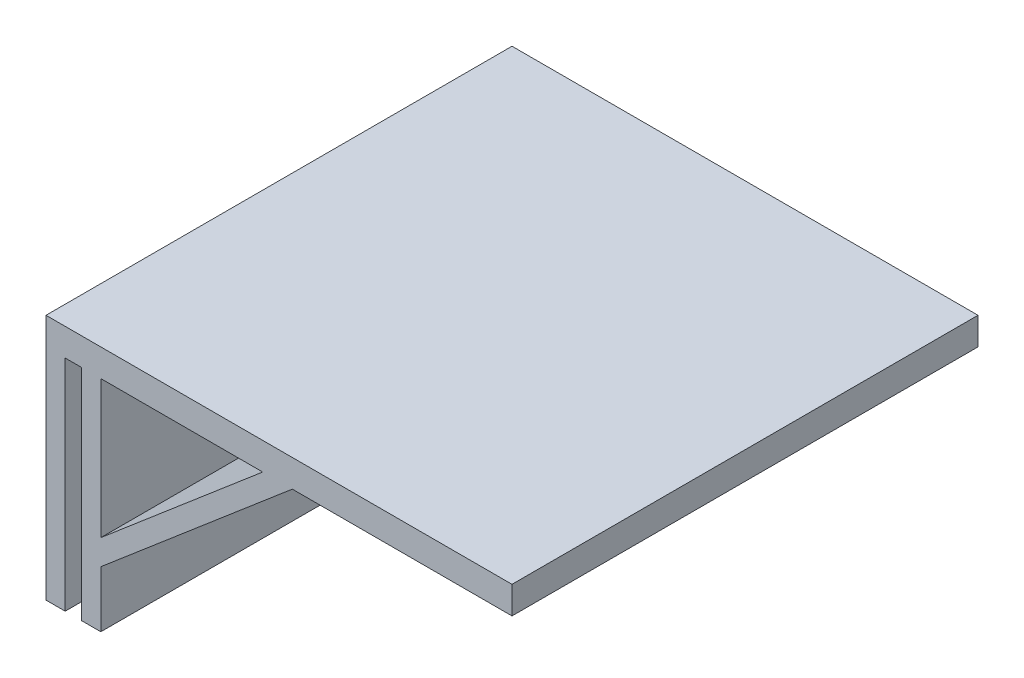
ISO-10303-21;
HEADER;
FILE_DESCRIPTION(('STEP AP214'),'2;1');
FILE_NAME('part.step','',(''),(''),'','','');
FILE_SCHEMA(('AUTOMOTIVE_DESIGN { 1 0 10303 214 1 1 1 1 }'));
ENDSEC;
DATA;
#1=APPLICATION_CONTEXT('core data for automotive mechanical design processes');
#2=APPLICATION_PROTOCOL_DEFINITION('international standard','automotive_design',2000,#1);
#3=PRODUCT_CONTEXT('',#1,'mechanical');
#4=PRODUCT('Part','Part','',(#3));
#5=PRODUCT_RELATED_PRODUCT_CATEGORY('part','',(#4));
#6=PRODUCT_DEFINITION_FORMATION('','',#4);
#7=PRODUCT_DEFINITION_CONTEXT('part definition',#1,'design');
#8=PRODUCT_DEFINITION('design','',#6,#7);
#9=PRODUCT_DEFINITION_SHAPE('','',#8);
#10=(LENGTH_UNIT() NAMED_UNIT(*) SI_UNIT(.MILLI.,.METRE.));
#11=(NAMED_UNIT(*) PLANE_ANGLE_UNIT() SI_UNIT($,.RADIAN.));
#12=(NAMED_UNIT(*) SI_UNIT($,.STERADIAN.) SOLID_ANGLE_UNIT());
#13=UNCERTAINTY_MEASURE_WITH_UNIT(LENGTH_MEASURE(1.E-05),#10,'distance_accuracy_value','');
#14=(GEOMETRIC_REPRESENTATION_CONTEXT(3) GLOBAL_UNCERTAINTY_ASSIGNED_CONTEXT((#13)) GLOBAL_UNIT_ASSIGNED_CONTEXT((#10,
#11,#12)) REPRESENTATION_CONTEXT('',''));
#15=CARTESIAN_POINT('',(0.,0.,0.));
#16=DIRECTION('',(0.,0.,1.));
#17=DIRECTION('',(1.,0.,0.));
#18=AXIS2_PLACEMENT_3D('',#15,#16,#17);
#19=CARTESIAN_POINT('',(20.,0.,170.));
#20=DIRECTION('',(-1.,0.,0.));
#21=DIRECTION('',(0.,0.,1.));
#22=AXIS2_PLACEMENT_3D('',#19,#20,#21);
#23=PLANE('',#22);
#24=DIRECTION('',(0.,1.,0.));
#25=VECTOR('',#24,1.);
#26=CARTESIAN_POINT('',(20.,0.,0.));
#27=LINE('',#26,#25);
#28=CARTESIAN_POINT('',(20.,0.,0.));
#29=VERTEX_POINT('',#28);
#30=CARTESIAN_POINT('',(20.,20.5625939833792,0.));
#31=VERTEX_POINT('',#30);
#32=EDGE_CURVE('E167',#29,#31,#27,.T.);
#33=ORIENTED_EDGE('',*,*,#32,.T.);
#34=DIRECTION('',(0.,0.,-1.));
#35=VECTOR('',#34,1.);
#36=CARTESIAN_POINT('',(20.,20.5625939833792,170.));
#37=LINE('',#36,#35);
#38=CARTESIAN_POINT('',(20.,20.5625939833792,170.));
#39=VERTEX_POINT('',#38);
#40=EDGE_CURVE('E11',#39,#31,#37,.T.);
#41=ORIENTED_EDGE('',*,*,#40,.F.);
#42=DIRECTION('',(0.,1.,0.));
#43=VECTOR('',#42,1.);
#44=CARTESIAN_POINT('',(20.,0.,170.));
#45=LINE('',#44,#43);
#46=CARTESIAN_POINT('',(20.,0.,170.));
#47=VERTEX_POINT('',#46);
#48=EDGE_CURVE('E169',#47,#39,#45,.T.);
#49=ORIENTED_EDGE('',*,*,#48,.F.);
#50=DIRECTION('',(0.,0.,-1.));
#51=VECTOR('',#50,1.);
#52=CARTESIAN_POINT('',(20.,0.,170.));
#53=LINE('',#52,#51);
#54=EDGE_CURVE('E201',#47,#29,#53,.T.);
#55=ORIENTED_EDGE('',*,*,#54,.T.);
#56=EDGE_LOOP('',(#33,#41,#49,#55));
#57=FACE_BOUND('',#56,.T.);
#58=ADVANCED_FACE('F41',(#57),#23,.F.);
#59=CARTESIAN_POINT('',(-1.75050218526914,2.05750430064305,170.));
#60=DIRECTION('',(-0.647997260673011,0.761642665664335,0.));
#61=DIRECTION('',(-0.761642665664335,-0.647997260673011,0.));
#62=AXIS2_PLACEMENT_3D('',#59,#60,#61);
#63=PLANE('',#62);
#64=DIRECTION('',(0.761642665664335,0.647997260673011,0.));
#65=VECTOR('',#64,1.);
#66=CARTESIAN_POINT('',(-1.75050218526914,2.05750430064305,0.));
#67=LINE('',#66,#65);
#68=CARTESIAN_POINT('',(89.8615057595381,80.,0.));
#69=VERTEX_POINT('',#68);
#70=EDGE_CURVE('E204',#31,#69,#67,.T.);
#71=ORIENTED_EDGE('',*,*,#70,.T.);
#72=DIRECTION('',(0.,0.,-1.));
#73=VECTOR('',#72,1.);
#74=CARTESIAN_POINT('',(89.8615057595381,80.,170.));
#75=LINE('',#74,#73);
#76=CARTESIAN_POINT('',(89.8615057595381,80.,170.));
#77=VERTEX_POINT('',#76);
#78=EDGE_CURVE('E48',#77,#69,#75,.T.);
#79=ORIENTED_EDGE('',*,*,#78,.F.);
#80=DIRECTION('',(0.761642665664335,0.647997260673011,0.));
#81=VECTOR('',#80,1.);
#82=CARTESIAN_POINT('',(-1.75050218526914,2.05750430064305,170.));
#83=LINE('',#82,#81);
#84=EDGE_CURVE('E172',#39,#77,#83,.T.);
#85=ORIENTED_EDGE('',*,*,#84,.F.);
#86=ORIENTED_EDGE('',*,*,#40,.T.);
#87=EDGE_LOOP('',(#71,#79,#85,#86));
#88=FACE_BOUND('',#87,.T.);
#89=ADVANCED_FACE('F294',(#88),#63,.F.);
#90=CARTESIAN_POINT('',(0.,80.,170.));
#91=DIRECTION('',(0.,1.,0.));
#92=DIRECTION('',(0.,0.,1.));
#93=AXIS2_PLACEMENT_3D('',#90,#91,#92);
#94=PLANE('',#93);
#95=DIRECTION('',(1.,0.,0.));
#96=VECTOR('',#95,1.);
#97=CARTESIAN_POINT('',(0.,80.,0.));
#98=LINE('',#97,#96);
#99=CARTESIAN_POINT('',(170.,80.,0.));
#100=VERTEX_POINT('',#99);
#101=EDGE_CURVE('E206',#69,#100,#98,.T.);
#102=ORIENTED_EDGE('',*,*,#101,.T.);
#103=DIRECTION('',(0.,0.,-1.));
#104=VECTOR('',#103,1.);
#105=CARTESIAN_POINT('',(170.,80.,170.));
#106=LINE('',#105,#104);
#107=CARTESIAN_POINT('',(170.,80.,170.));
#108=VERTEX_POINT('',#107);
#109=EDGE_CURVE('E247',#108,#100,#106,.T.);
#110=ORIENTED_EDGE('',*,*,#109,.F.);
#111=DIRECTION('',(1.,0.,0.));
#112=VECTOR('',#111,1.);
#113=CARTESIAN_POINT('',(0.,80.,170.));
#114=LINE('',#113,#112);
#115=EDGE_CURVE('E175',#77,#108,#114,.T.);
#116=ORIENTED_EDGE('',*,*,#115,.F.);
#117=ORIENTED_EDGE('',*,*,#78,.T.);
#118=EDGE_LOOP('',(#102,#110,#116,#117));
#119=FACE_BOUND('',#118,.T.);
#120=ADVANCED_FACE('F253',(#119),#94,.F.);
#121=CARTESIAN_POINT('',(170.,0.,170.));
#122=DIRECTION('',(1.,0.,0.));
#123=DIRECTION('',(0.,0.,-1.));
#124=AXIS2_PLACEMENT_3D('',#121,#122,#123);
#125=PLANE('',#124);
#126=DIRECTION('',(0.,-1.,0.));
#127=VECTOR('',#126,1.);
#128=CARTESIAN_POINT('',(170.,0.,0.));
#129=LINE('',#128,#127);
#130=CARTESIAN_POINT('',(170.,90.,0.));
#131=VERTEX_POINT('',#130);
#132=EDGE_CURVE('E209',#131,#100,#129,.T.);
#133=ORIENTED_EDGE('',*,*,#132,.F.);
#134=DIRECTION('',(0.,0.,-1.));
#135=VECTOR('',#134,1.);
#136=CARTESIAN_POINT('',(170.,90.,170.));
#137=LINE('',#136,#135);
#138=CARTESIAN_POINT('',(170.,90.,170.));
#139=VERTEX_POINT('',#138);
#140=EDGE_CURVE('E245',#139,#131,#137,.T.);
#141=ORIENTED_EDGE('',*,*,#140,.F.);
#142=DIRECTION('',(0.,-1.,0.));
#143=VECTOR('',#142,1.);
#144=CARTESIAN_POINT('',(170.,0.,170.));
#145=LINE('',#144,#143);
#146=EDGE_CURVE('E177',#139,#108,#145,.T.);
#147=ORIENTED_EDGE('',*,*,#146,.T.);
#148=ORIENTED_EDGE('',*,*,#109,.T.);
#149=EDGE_LOOP('',(#133,#141,#147,#148));
#150=FACE_BOUND('',#149,.T.);
#151=ADVANCED_FACE('F260',(#150),#125,.T.);
#152=CARTESIAN_POINT('',(0.,90.,170.));
#153=DIRECTION('',(0.,1.,0.));
#154=DIRECTION('',(0.,0.,1.));
#155=AXIS2_PLACEMENT_3D('',#152,#153,#154);
#156=PLANE('',#155);
#157=DIRECTION('',(1.,0.,0.));
#158=VECTOR('',#157,1.);
#159=CARTESIAN_POINT('',(0.,90.,0.));
#160=LINE('',#159,#158);
#161=CARTESIAN_POINT('',(0.,90.,0.));
#162=VERTEX_POINT('',#161);
#163=EDGE_CURVE('E212',#162,#131,#160,.T.);
#164=ORIENTED_EDGE('',*,*,#163,.F.);
#165=DIRECTION('',(0.,0.,-1.));
#166=VECTOR('',#165,1.);
#167=CARTESIAN_POINT('',(0.,90.,170.));
#168=LINE('',#167,#166);
#169=CARTESIAN_POINT('',(0.,90.,170.));
#170=VERTEX_POINT('',#169);
#171=EDGE_CURVE('E243',#170,#162,#168,.T.);
#172=ORIENTED_EDGE('',*,*,#171,.F.);
#173=DIRECTION('',(1.,0.,0.));
#174=VECTOR('',#173,1.);
#175=CARTESIAN_POINT('',(0.,90.,170.));
#176=LINE('',#175,#174);
#177=EDGE_CURVE('E180',#170,#139,#176,.T.);
#178=ORIENTED_EDGE('',*,*,#177,.T.);
#179=ORIENTED_EDGE('',*,*,#140,.T.);
#180=EDGE_LOOP('',(#164,#172,#178,#179));
#181=FACE_BOUND('',#180,.T.);
#182=ADVANCED_FACE('F267',(#181),#156,.T.);
#183=CARTESIAN_POINT('',(0.,0.,170.));
#184=DIRECTION('',(-1.,0.,0.));
#185=DIRECTION('',(0.,0.,1.));
#186=AXIS2_PLACEMENT_3D('',#183,#184,#185);
#187=PLANE('',#186);
#188=DIRECTION('',(0.,1.,0.));
#189=VECTOR('',#188,1.);
#190=CARTESIAN_POINT('',(0.,0.,0.));
#191=LINE('',#190,#189);
#192=CARTESIAN_POINT('',(0.,0.,0.));
#193=VERTEX_POINT('',#192);
#194=EDGE_CURVE('E215',#193,#162,#191,.T.);
#195=ORIENTED_EDGE('',*,*,#194,.F.);
#196=DIRECTION('',(0.,0.,-1.));
#197=VECTOR('',#196,1.);
#198=CARTESIAN_POINT('',(0.,0.,170.));
#199=LINE('',#198,#197);
#200=CARTESIAN_POINT('',(0.,0.,170.));
#201=VERTEX_POINT('',#200);
#202=EDGE_CURVE('E241',#201,#193,#199,.T.);
#203=ORIENTED_EDGE('',*,*,#202,.F.);
#204=DIRECTION('',(0.,1.,0.));
#205=VECTOR('',#204,1.);
#206=CARTESIAN_POINT('',(0.,0.,170.));
#207=LINE('',#206,#205);
#208=EDGE_CURVE('E183',#201,#170,#207,.T.);
#209=ORIENTED_EDGE('',*,*,#208,.T.);
#210=ORIENTED_EDGE('',*,*,#171,.T.);
#211=EDGE_LOOP('',(#195,#203,#209,#210));
#212=FACE_BOUND('',#211,.T.);
#213=ADVANCED_FACE('F270',(#212),#187,.T.);
#214=CARTESIAN_POINT('',(0.,0.,170.));
#215=DIRECTION('',(0.,-1.,0.));
#216=DIRECTION('',(0.,0.,-1.));
#217=AXIS2_PLACEMENT_3D('',#214,#215,#216);
#218=PLANE('',#217);
#219=DIRECTION('',(-1.,0.,0.));
#220=VECTOR('',#219,1.);
#221=CARTESIAN_POINT('',(0.,0.,0.));
#222=LINE('',#221,#220);
#223=CARTESIAN_POINT('',(7.,0.,0.));
#224=VERTEX_POINT('',#223);
#225=EDGE_CURVE('E218',#224,#193,#222,.T.);
#226=ORIENTED_EDGE('',*,*,#225,.F.);
#227=DIRECTION('',(0.,0.,-1.));
#228=VECTOR('',#227,1.);
#229=CARTESIAN_POINT('',(7.,0.,170.));
#230=LINE('',#229,#228);
#231=CARTESIAN_POINT('',(7.,0.,170.));
#232=VERTEX_POINT('',#231);
#233=EDGE_CURVE('E239',#232,#224,#230,.T.);
#234=ORIENTED_EDGE('',*,*,#233,.F.);
#235=DIRECTION('',(-1.,0.,0.));
#236=VECTOR('',#235,1.);
#237=CARTESIAN_POINT('',(0.,0.,170.));
#238=LINE('',#237,#236);
#239=EDGE_CURVE('E186',#232,#201,#238,.T.);
#240=ORIENTED_EDGE('',*,*,#239,.T.);
#241=ORIENTED_EDGE('',*,*,#202,.T.);
#242=EDGE_LOOP('',(#226,#234,#240,#241));
#243=FACE_BOUND('',#242,.T.);
#244=ADVANCED_FACE('F275',(#243),#218,.T.);
#245=CARTESIAN_POINT('',(7.,0.,170.));
#246=DIRECTION('',(1.,0.,0.));
#247=DIRECTION('',(0.,1.,0.));
#248=AXIS2_PLACEMENT_3D('',#245,#246,#247);
#249=PLANE('',#248);
#250=DIRECTION('',(0.,-1.,0.));
#251=VECTOR('',#250,1.);
#252=CARTESIAN_POINT('',(7.,0.,0.));
#253=LINE('',#252,#251);
#254=CARTESIAN_POINT('',(6.99999999999999,80.,0.));
#255=VERTEX_POINT('',#254);
#256=EDGE_CURVE('E221',#255,#224,#253,.T.);
#257=ORIENTED_EDGE('',*,*,#256,.F.);
#258=DIRECTION('',(0.,0.,-1.));
#259=VECTOR('',#258,1.);
#260=CARTESIAN_POINT('',(6.99999999999999,80.,170.));
#261=LINE('',#260,#259);
#262=CARTESIAN_POINT('',(6.99999999999999,80.,170.));
#263=VERTEX_POINT('',#262);
#264=EDGE_CURVE('E237',#263,#255,#261,.T.);
#265=ORIENTED_EDGE('',*,*,#264,.F.);
#266=DIRECTION('',(0.,-1.,0.));
#267=VECTOR('',#266,1.);
#268=CARTESIAN_POINT('',(7.,0.,170.));
#269=LINE('',#268,#267);
#270=EDGE_CURVE('E189',#263,#232,#269,.T.);
#271=ORIENTED_EDGE('',*,*,#270,.T.);
#272=ORIENTED_EDGE('',*,*,#233,.T.);
#273=EDGE_LOOP('',(#257,#265,#271,#272));
#274=FACE_BOUND('',#273,.T.);
#275=ADVANCED_FACE('F278',(#274),#249,.T.);
#276=CARTESIAN_POINT('',(0.,80.,170.));
#277=DIRECTION('',(0.,-1.,0.));
#278=DIRECTION('',(0.,0.,-1.));
#279=AXIS2_PLACEMENT_3D('',#276,#277,#278);
#280=PLANE('',#279);
#281=DIRECTION('',(-1.,0.,0.));
#282=VECTOR('',#281,1.);
#283=CARTESIAN_POINT('',(0.,80.,0.));
#284=LINE('',#283,#282);
#285=CARTESIAN_POINT('',(13.,80.,0.));
#286=VERTEX_POINT('',#285);
#287=EDGE_CURVE('E224',#286,#255,#284,.T.);
#288=ORIENTED_EDGE('',*,*,#287,.F.);
#289=DIRECTION('',(0.,0.,-1.));
#290=VECTOR('',#289,1.);
#291=CARTESIAN_POINT('',(13.,80.,170.));
#292=LINE('',#291,#290);
#293=CARTESIAN_POINT('',(13.,80.,170.));
#294=VERTEX_POINT('',#293);
#295=EDGE_CURVE('E235',#294,#286,#292,.T.);
#296=ORIENTED_EDGE('',*,*,#295,.F.);
#297=DIRECTION('',(-1.,0.,0.));
#298=VECTOR('',#297,1.);
#299=CARTESIAN_POINT('',(0.,80.,170.));
#300=LINE('',#299,#298);
#301=EDGE_CURVE('E192',#294,#263,#300,.T.);
#302=ORIENTED_EDGE('',*,*,#301,.T.);
#303=ORIENTED_EDGE('',*,*,#264,.T.);
#304=EDGE_LOOP('',(#288,#296,#302,#303));
#305=FACE_BOUND('',#304,.T.);
#306=ADVANCED_FACE('F283',(#305),#280,.T.);
#307=CARTESIAN_POINT('',(13.,0.,170.));
#308=DIRECTION('',(-1.,0.,0.));
#309=DIRECTION('',(0.,0.,1.));
#310=AXIS2_PLACEMENT_3D('',#307,#308,#309);
#311=PLANE('',#310);
#312=DIRECTION('',(0.,1.,0.));
#313=VECTOR('',#312,1.);
#314=CARTESIAN_POINT('',(13.,0.,0.));
#315=LINE('',#314,#313);
#316=CARTESIAN_POINT('',(13.,0.,0.));
#317=VERTEX_POINT('',#316);
#318=EDGE_CURVE('E227',#317,#286,#315,.T.);
#319=ORIENTED_EDGE('',*,*,#318,.F.);
#320=DIRECTION('',(0.,0.,-1.));
#321=VECTOR('',#320,1.);
#322=CARTESIAN_POINT('',(13.,0.,170.));
#323=LINE('',#322,#321);
#324=CARTESIAN_POINT('',(13.,0.,170.));
#325=VERTEX_POINT('',#324);
#326=EDGE_CURVE('E233',#325,#317,#323,.T.);
#327=ORIENTED_EDGE('',*,*,#326,.F.);
#328=DIRECTION('',(0.,1.,0.));
#329=VECTOR('',#328,1.);
#330=CARTESIAN_POINT('',(13.,0.,170.));
#331=LINE('',#330,#329);
#332=EDGE_CURVE('E195',#325,#294,#331,.T.);
#333=ORIENTED_EDGE('',*,*,#332,.T.);
#334=ORIENTED_EDGE('',*,*,#295,.T.);
#335=EDGE_LOOP('',(#319,#327,#333,#334));
#336=FACE_BOUND('',#335,.T.);
#337=ADVANCED_FACE('F286',(#336),#311,.T.);
#338=CARTESIAN_POINT('',(0.,0.,170.));
#339=DIRECTION('',(0.,-1.,0.));
#340=DIRECTION('',(1.,0.,0.));
#341=AXIS2_PLACEMENT_3D('',#338,#339,#340);
#342=PLANE('',#341);
#343=DIRECTION('',(-1.,0.,0.));
#344=VECTOR('',#343,1.);
#345=CARTESIAN_POINT('',(0.,0.,0.));
#346=LINE('',#345,#344);
#347=EDGE_CURVE('E173',#29,#317,#346,.T.);
#348=ORIENTED_EDGE('',*,*,#347,.F.);
#349=ORIENTED_EDGE('',*,*,#54,.F.);
#350=DIRECTION('',(-1.,0.,0.));
#351=VECTOR('',#350,1.);
#352=CARTESIAN_POINT('',(0.,0.,170.));
#353=LINE('',#352,#351);
#354=EDGE_CURVE('E198',#47,#325,#353,.T.);
#355=ORIENTED_EDGE('',*,*,#354,.T.);
#356=ORIENTED_EDGE('',*,*,#326,.T.);
#357=EDGE_LOOP('',(#348,#349,#355,#356));
#358=FACE_BOUND('',#357,.T.);
#359=ADVANCED_FACE('F290',(#358),#342,.T.);
#360=CARTESIAN_POINT('',(0.,0.,170.));
#361=DIRECTION('',(0.,0.,1.));
#362=DIRECTION('',(1.,0.,0.));
#363=AXIS2_PLACEMENT_3D('',#360,#361,#362);
#364=PLANE('',#363);
#365=DIRECTION('',(0.,-1.,0.));
#366=VECTOR('',#365,1.);
#367=CARTESIAN_POINT('',(20.,80.,170.));
#368=LINE('',#367,#366);
#369=CARTESIAN_POINT('',(20.,80.,170.));
#370=VERTEX_POINT('',#369);
#371=CARTESIAN_POINT('',(20.,29.7532555830603,170.));
#372=VERTEX_POINT('',#371);
#373=EDGE_CURVE('E55',#370,#372,#368,.T.);
#374=ORIENTED_EDGE('',*,*,#373,.F.);
#375=DIRECTION('',(-1.,0.,0.));
#376=VECTOR('',#375,1.);
#377=CARTESIAN_POINT('',(20.,80.,170.));
#378=LINE('',#377,#376);
#379=CARTESIAN_POINT('',(79.0589909576549,80.,170.));
#380=VERTEX_POINT('',#379);
#381=EDGE_CURVE('E156',#380,#370,#378,.T.);
#382=ORIENTED_EDGE('',*,*,#381,.F.);
#383=DIRECTION('',(0.761642665664335,0.647997260673011,0.));
#384=VECTOR('',#383,1.);
#385=CARTESIAN_POINT('',(79.0589909576549,80.,170.));
#386=LINE('',#385,#384);
#387=EDGE_CURVE('E159',#372,#380,#386,.T.);
#388=ORIENTED_EDGE('',*,*,#387,.F.);
#389=EDGE_LOOP('',(#374,#382,#388));
#390=FACE_BOUND('',#389,.T.);
#391=ORIENTED_EDGE('',*,*,#48,.T.);
#392=ORIENTED_EDGE('',*,*,#84,.T.);
#393=ORIENTED_EDGE('',*,*,#115,.T.);
#394=ORIENTED_EDGE('',*,*,#146,.F.);
#395=ORIENTED_EDGE('',*,*,#177,.F.);
#396=ORIENTED_EDGE('',*,*,#208,.F.);
#397=ORIENTED_EDGE('',*,*,#239,.F.);
#398=ORIENTED_EDGE('',*,*,#270,.F.);
#399=ORIENTED_EDGE('',*,*,#301,.F.);
#400=ORIENTED_EDGE('',*,*,#332,.F.);
#401=ORIENTED_EDGE('',*,*,#354,.F.);
#402=EDGE_LOOP('',(#391,#392,#393,#394,#395,#396,#397,#398,#399,#400,#401));
#403=FACE_BOUND('',#402,.T.);
#404=ADVANCED_FACE('F264',(#390,#403),#364,.T.);
#405=CARTESIAN_POINT('',(0.,0.,0.));
#406=DIRECTION('',(0.,0.,1.));
#407=DIRECTION('',(1.,0.,0.));
#408=AXIS2_PLACEMENT_3D('',#405,#406,#407);
#409=PLANE('',#408);
#410=DIRECTION('',(-1.,0.,0.));
#411=VECTOR('',#410,1.);
#412=CARTESIAN_POINT('',(20.,80.,0.));
#413=LINE('',#412,#411);
#414=CARTESIAN_POINT('',(79.0589909576549,80.,0.));
#415=VERTEX_POINT('',#414);
#416=CARTESIAN_POINT('',(20.,80.,0.));
#417=VERTEX_POINT('',#416);
#418=EDGE_CURVE('E63',#415,#417,#413,.T.);
#419=ORIENTED_EDGE('',*,*,#418,.T.);
#420=DIRECTION('',(0.,-1.,0.));
#421=VECTOR('',#420,1.);
#422=CARTESIAN_POINT('',(20.,80.,0.));
#423=LINE('',#422,#421);
#424=CARTESIAN_POINT('',(20.,29.7532555830603,0.));
#425=VERTEX_POINT('',#424);
#426=EDGE_CURVE('E143',#417,#425,#423,.T.);
#427=ORIENTED_EDGE('',*,*,#426,.T.);
#428=DIRECTION('',(0.761642665664335,0.647997260673011,0.));
#429=VECTOR('',#428,1.);
#430=CARTESIAN_POINT('',(79.0589909576549,80.,0.));
#431=LINE('',#430,#429);
#432=EDGE_CURVE('E150',#425,#415,#431,.T.);
#433=ORIENTED_EDGE('',*,*,#432,.T.);
#434=EDGE_LOOP('',(#419,#427,#433));
#435=FACE_BOUND('',#434,.T.);
#436=ORIENTED_EDGE('',*,*,#32,.F.);
#437=ORIENTED_EDGE('',*,*,#347,.T.);
#438=ORIENTED_EDGE('',*,*,#318,.T.);
#439=ORIENTED_EDGE('',*,*,#287,.T.);
#440=ORIENTED_EDGE('',*,*,#256,.T.);
#441=ORIENTED_EDGE('',*,*,#225,.T.);
#442=ORIENTED_EDGE('',*,*,#194,.T.);
#443=ORIENTED_EDGE('',*,*,#163,.T.);
#444=ORIENTED_EDGE('',*,*,#132,.T.);
#445=ORIENTED_EDGE('',*,*,#101,.F.);
#446=ORIENTED_EDGE('',*,*,#70,.F.);
#447=EDGE_LOOP('',(#436,#437,#438,#439,#440,#441,#442,#443,#444,#445,#446));
#448=FACE_BOUND('',#447,.T.);
#449=ADVANCED_FACE('F154',(#435,#448),#409,.F.);
#450=CARTESIAN_POINT('',(20.,80.,0.));
#451=DIRECTION('',(-1.,0.,0.));
#452=DIRECTION('',(0.,-1.,0.));
#453=AXIS2_PLACEMENT_3D('',#450,#451,#452);
#454=PLANE('',#453);
#455=ORIENTED_EDGE('',*,*,#373,.T.);
#456=DIRECTION('',(0.,0.,1.));
#457=VECTOR('',#456,1.);
#458=CARTESIAN_POINT('',(20.,29.7532555830603,0.));
#459=LINE('',#458,#457);
#460=EDGE_CURVE('E139',#425,#372,#459,.T.);
#461=ORIENTED_EDGE('',*,*,#460,.F.);
#462=ORIENTED_EDGE('',*,*,#426,.F.);
#463=DIRECTION('',(0.,0.,1.));
#464=VECTOR('',#463,1.);
#465=CARTESIAN_POINT('',(20.,80.,0.));
#466=LINE('',#465,#464);
#467=EDGE_CURVE('E165',#417,#370,#466,.T.);
#468=ORIENTED_EDGE('',*,*,#467,.T.);
#469=EDGE_LOOP('',(#455,#461,#462,#468));
#470=FACE_BOUND('',#469,.T.);
#471=ADVANCED_FACE('F141',(#470),#454,.F.);
#472=CARTESIAN_POINT('',(20.,80.,0.));
#473=DIRECTION('',(0.,1.,0.));
#474=DIRECTION('',(0.,0.,1.));
#475=AXIS2_PLACEMENT_3D('',#472,#473,#474);
#476=PLANE('',#475);
#477=ORIENTED_EDGE('',*,*,#381,.T.);
#478=ORIENTED_EDGE('',*,*,#467,.F.);
#479=ORIENTED_EDGE('',*,*,#418,.F.);
#480=DIRECTION('',(0.,0.,1.));
#481=VECTOR('',#480,1.);
#482=CARTESIAN_POINT('',(79.0589909576549,80.,0.));
#483=LINE('',#482,#481);
#484=EDGE_CURVE('E147',#415,#380,#483,.T.);
#485=ORIENTED_EDGE('',*,*,#484,.T.);
#486=EDGE_LOOP('',(#477,#478,#479,#485));
#487=FACE_BOUND('',#486,.T.);
#488=ADVANCED_FACE('F325',(#487),#476,.F.);
#489=CARTESIAN_POINT('',(79.0589909576549,80.,0.));
#490=DIRECTION('',(0.647997260673011,-0.761642665664335,0.));
#491=DIRECTION('',(0.761642665664335,0.647997260673011,0.));
#492=AXIS2_PLACEMENT_3D('',#489,#490,#491);
#493=PLANE('',#492);
#494=ORIENTED_EDGE('',*,*,#387,.T.);
#495=ORIENTED_EDGE('',*,*,#484,.F.);
#496=ORIENTED_EDGE('',*,*,#432,.F.);
#497=ORIENTED_EDGE('',*,*,#460,.T.);
#498=EDGE_LOOP('',(#494,#495,#496,#497));
#499=FACE_BOUND('',#498,.T.);
#500=ADVANCED_FACE('F151',(#499),#493,.F.);
#501=CLOSED_SHELL('',(#58,#89,#120,#151,#182,#213,#244,#275,#306,#337,#359,#404,#449,#471,#488,#500));
#502=MANIFOLD_SOLID_BREP('B2',#501);
#503=ADVANCED_BREP_SHAPE_REPRESENTATION('',(#18,#502),#14);
#504=SHAPE_DEFINITION_REPRESENTATION(#9,#503);
ENDSEC;
END-ISO-10303-21;
